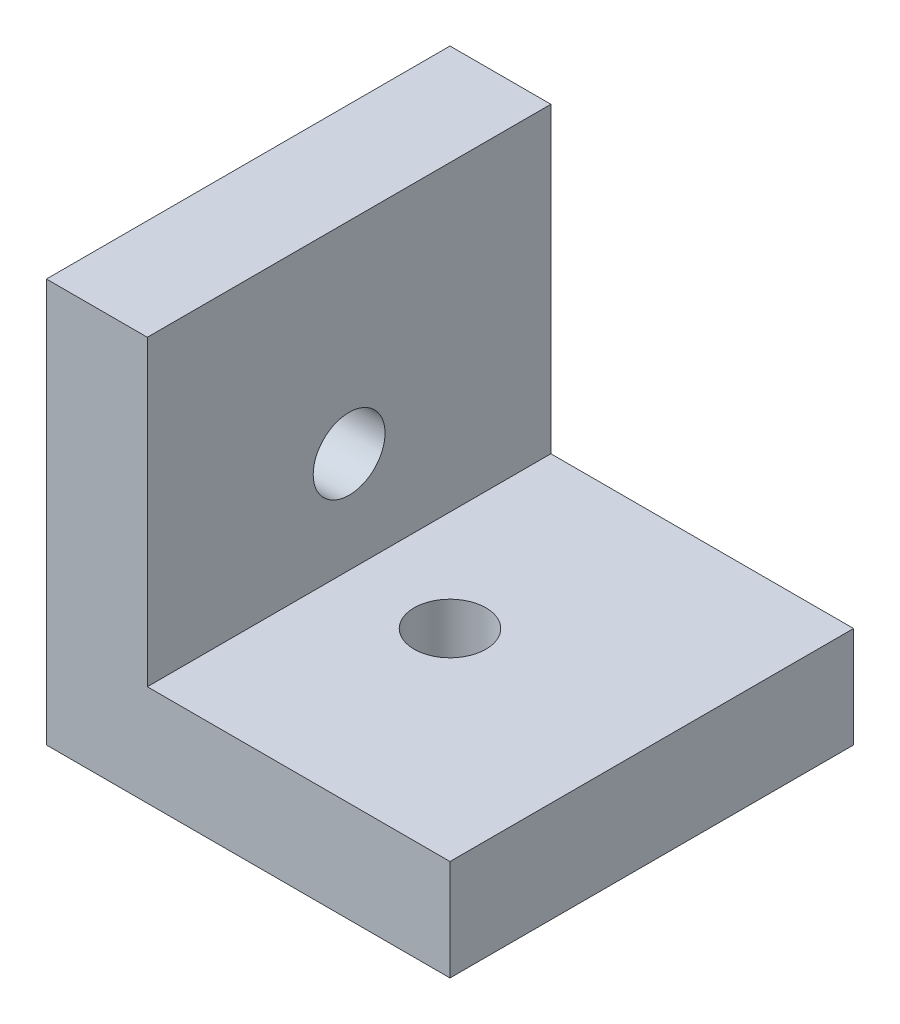
ISO-10303-21;
HEADER;
FILE_DESCRIPTION(('STEP AP214'),'2;1');
FILE_NAME('part.step','',(''),(''),'','','');
FILE_SCHEMA(('AUTOMOTIVE_DESIGN { 1 0 10303 214 1 1 1 1 }'));
ENDSEC;
DATA;
#1=APPLICATION_CONTEXT('core data for automotive mechanical design processes');
#2=APPLICATION_PROTOCOL_DEFINITION('international standard','automotive_design',2000,#1);
#3=PRODUCT_CONTEXT('',#1,'mechanical');
#4=PRODUCT('Part','Part','',(#3));
#5=PRODUCT_RELATED_PRODUCT_CATEGORY('part','',(#4));
#6=PRODUCT_DEFINITION_FORMATION('','',#4);
#7=PRODUCT_DEFINITION_CONTEXT('part definition',#1,'design');
#8=PRODUCT_DEFINITION('design','',#6,#7);
#9=PRODUCT_DEFINITION_SHAPE('','',#8);
#10=(LENGTH_UNIT() NAMED_UNIT(*) SI_UNIT(.MILLI.,.METRE.));
#11=(NAMED_UNIT(*) PLANE_ANGLE_UNIT() SI_UNIT($,.RADIAN.));
#12=(NAMED_UNIT(*) SI_UNIT($,.STERADIAN.) SOLID_ANGLE_UNIT());
#13=UNCERTAINTY_MEASURE_WITH_UNIT(LENGTH_MEASURE(1.E-05),#10,'distance_accuracy_value','');
#14=(GEOMETRIC_REPRESENTATION_CONTEXT(3) GLOBAL_UNCERTAINTY_ASSIGNED_CONTEXT((#13)) GLOBAL_UNIT_ASSIGNED_CONTEXT((#10,
#11,#12)) REPRESENTATION_CONTEXT('',''));
#15=CARTESIAN_POINT('',(0.,0.,0.));
#16=DIRECTION('',(0.,0.,1.));
#17=DIRECTION('',(1.,0.,0.));
#18=AXIS2_PLACEMENT_3D('',#15,#16,#17);
#19=CARTESIAN_POINT('',(-0.520215582321744,11.7280877938981,12.7));
#20=DIRECTION('',(1.,0.,0.));
#21=DIRECTION('',(0.,0.,-1.));
#22=AXIS2_PLACEMENT_3D('',#19,#20,#21);
#23=PLANE('',#22);
#24=CARTESIAN_POINT('',(-0.520215582321744,5.37808779389811,6.35));
#25=DIRECTION('',(-1.,0.,0.));
#26=DIRECTION('',(0.,0.,1.));
#27=AXIS2_PLACEMENT_3D('',#24,#25,#26);
#28=CIRCLE('',#27,1.1303);
#29=CARTESIAN_POINT('',(-0.520215582321744,5.37808779389811,7.4803));
#30=VERTEX_POINT('',#29);
#31=EDGE_CURVE('E165',#30,#30,#28,.T.);
#32=ORIENTED_EDGE('',*,*,#31,.F.);
#33=EDGE_LOOP('',(#32));
#34=FACE_BOUND('',#33,.T.);
#35=DIRECTION('',(0.,-1.,0.));
#36=VECTOR('',#35,1.);
#37=CARTESIAN_POINT('',(-0.520215582321744,11.7280877938981,0.));
#38=LINE('',#37,#36);
#39=CARTESIAN_POINT('',(-0.520215582321744,11.7280877938981,0.));
#40=VERTEX_POINT('',#39);
#41=CARTESIAN_POINT('',(-0.520215582321744,-0.971912206101887,0.));
#42=VERTEX_POINT('',#41);
#43=EDGE_CURVE('E120',#40,#42,#38,.T.);
#44=ORIENTED_EDGE('',*,*,#43,.T.);
#45=DIRECTION('',(0.,0.,-1.));
#46=VECTOR('',#45,1.);
#47=CARTESIAN_POINT('',(-0.520215582321744,-0.971912206101887,12.7));
#48=LINE('',#47,#46);
#49=CARTESIAN_POINT('',(-0.520215582321744,-0.971912206101887,12.7));
#50=VERTEX_POINT('',#49);
#51=EDGE_CURVE('E11',#50,#42,#48,.T.);
#52=ORIENTED_EDGE('',*,*,#51,.F.);
#53=DIRECTION('',(0.,-1.,0.));
#54=VECTOR('',#53,1.);
#55=CARTESIAN_POINT('',(-0.520215582321744,11.7280877938981,12.7));
#56=LINE('',#55,#54);
#57=CARTESIAN_POINT('',(-0.520215582321744,11.7280877938981,12.7));
#58=VERTEX_POINT('',#57);
#59=EDGE_CURVE('E131',#58,#50,#56,.T.);
#60=ORIENTED_EDGE('',*,*,#59,.F.);
#61=DIRECTION('',(0.,0.,-1.));
#62=VECTOR('',#61,1.);
#63=CARTESIAN_POINT('',(-0.520215582321744,11.7280877938981,12.7));
#64=LINE('',#63,#62);
#65=EDGE_CURVE('E116',#58,#40,#64,.T.);
#66=ORIENTED_EDGE('',*,*,#65,.T.);
#67=EDGE_LOOP('',(#44,#52,#60,#66));
#68=FACE_BOUND('',#67,.T.);
#69=ADVANCED_FACE('F35',(#34,#68),#23,.F.);
#70=CARTESIAN_POINT('',(-0.520215582321744,-0.971912206101887,12.7));
#71=DIRECTION('',(0.,1.,0.));
#72=DIRECTION('',(0.,0.,1.));
#73=AXIS2_PLACEMENT_3D('',#70,#71,#72);
#74=PLANE('',#73);
#75=CARTESIAN_POINT('',(5.82978441767826,-0.971912206101887,6.35));
#76=DIRECTION('',(0.,-1.,0.));
#77=DIRECTION('',(0.,0.,-1.));
#78=AXIS2_PLACEMENT_3D('',#75,#76,#77);
#79=CIRCLE('',#78,1.1303);
#80=CARTESIAN_POINT('',(5.82978441767826,-0.971912206101887,5.2197));
#81=VERTEX_POINT('',#80);
#82=EDGE_CURVE('E169',#81,#81,#79,.T.);
#83=ORIENTED_EDGE('',*,*,#82,.F.);
#84=EDGE_LOOP('',(#83));
#85=FACE_BOUND('',#84,.T.);
#86=DIRECTION('',(1.,0.,0.));
#87=VECTOR('',#86,1.);
#88=CARTESIAN_POINT('',(-0.520215582321744,-0.971912206101887,0.));
#89=LINE('',#88,#87);
#90=CARTESIAN_POINT('',(12.1797844176783,-0.971912206101887,0.));
#91=VERTEX_POINT('',#90);
#92=EDGE_CURVE('E123',#42,#91,#89,.T.);
#93=ORIENTED_EDGE('',*,*,#92,.T.);
#94=DIRECTION('',(0.,0.,-1.));
#95=VECTOR('',#94,1.);
#96=CARTESIAN_POINT('',(12.1797844176783,-0.971912206101887,12.7));
#97=LINE('',#96,#95);
#98=CARTESIAN_POINT('',(12.1797844176783,-0.971912206101887,12.7));
#99=VERTEX_POINT('',#98);
#100=EDGE_CURVE('E44',#99,#91,#97,.T.);
#101=ORIENTED_EDGE('',*,*,#100,.F.);
#102=DIRECTION('',(1.,0.,0.));
#103=VECTOR('',#102,1.);
#104=CARTESIAN_POINT('',(-0.520215582321744,-0.971912206101887,12.7));
#105=LINE('',#104,#103);
#106=EDGE_CURVE('E89',#50,#99,#105,.T.);
#107=ORIENTED_EDGE('',*,*,#106,.F.);
#108=ORIENTED_EDGE('',*,*,#51,.T.);
#109=EDGE_LOOP('',(#93,#101,#107,#108));
#110=FACE_BOUND('',#109,.T.);
#111=ADVANCED_FACE('F157',(#85,#110),#74,.F.);
#112=CARTESIAN_POINT('',(12.1797844176783,2.20308779389811,12.7));
#113=DIRECTION('',(-1.,0.,0.));
#114=DIRECTION('',(0.,-1.,0.));
#115=AXIS2_PLACEMENT_3D('',#112,#113,#114);
#116=PLANE('',#115);
#117=DIRECTION('',(0.,1.,0.));
#118=VECTOR('',#117,1.);
#119=CARTESIAN_POINT('',(12.1797844176783,2.20308779389811,0.));
#120=LINE('',#119,#118);
#121=CARTESIAN_POINT('',(12.1797844176783,2.20308779389811,0.));
#122=VERTEX_POINT('',#121);
#123=EDGE_CURVE('E126',#91,#122,#120,.T.);
#124=ORIENTED_EDGE('',*,*,#123,.T.);
#125=DIRECTION('',(0.,0.,-1.));
#126=VECTOR('',#125,1.);
#127=CARTESIAN_POINT('',(12.1797844176783,2.20308779389811,12.7));
#128=LINE('',#127,#126);
#129=CARTESIAN_POINT('',(12.1797844176783,2.20308779389811,12.7));
#130=VERTEX_POINT('',#129);
#131=EDGE_CURVE('E111',#130,#122,#128,.T.);
#132=ORIENTED_EDGE('',*,*,#131,.F.);
#133=DIRECTION('',(0.,1.,0.));
#134=VECTOR('',#133,1.);
#135=CARTESIAN_POINT('',(12.1797844176783,2.20308779389811,12.7));
#136=LINE('',#135,#134);
#137=EDGE_CURVE('E102',#99,#130,#136,.T.);
#138=ORIENTED_EDGE('',*,*,#137,.F.);
#139=ORIENTED_EDGE('',*,*,#100,.T.);
#140=EDGE_LOOP('',(#124,#132,#138,#139));
#141=FACE_BOUND('',#140,.T.);
#142=ADVANCED_FACE('F138',(#141),#116,.F.);
#143=CARTESIAN_POINT('',(12.1797844176783,2.20308779389811,12.7));
#144=DIRECTION('',(0.,-1.,0.));
#145=DIRECTION('',(1.,0.,0.));
#146=AXIS2_PLACEMENT_3D('',#143,#144,#145);
#147=PLANE('',#146);
#148=CARTESIAN_POINT('',(5.82978441767826,2.20308779389811,6.35));
#149=DIRECTION('',(0.,-1.,0.));
#150=DIRECTION('',(1.,0.,0.));
#151=AXIS2_PLACEMENT_3D('',#148,#149,#150);
#152=CIRCLE('',#151,1.1303);
#153=CARTESIAN_POINT('',(6.96008441767825,2.20308779389811,6.35));
#154=VERTEX_POINT('',#153);
#155=EDGE_CURVE('E124',#154,#154,#152,.T.);
#156=ORIENTED_EDGE('',*,*,#155,.T.);
#157=EDGE_LOOP('',(#156));
#158=FACE_BOUND('',#157,.T.);
#159=DIRECTION('',(-1.,0.,0.));
#160=VECTOR('',#159,1.);
#161=CARTESIAN_POINT('',(12.1797844176783,2.20308779389811,0.));
#162=LINE('',#161,#160);
#163=CARTESIAN_POINT('',(2.65478441767826,2.20308779389811,0.));
#164=VERTEX_POINT('',#163);
#165=EDGE_CURVE('E110',#122,#164,#162,.T.);
#166=ORIENTED_EDGE('',*,*,#165,.T.);
#167=DIRECTION('',(0.,0.,-1.));
#168=VECTOR('',#167,1.);
#169=CARTESIAN_POINT('',(2.65478441767826,2.20308779389811,12.7));
#170=LINE('',#169,#168);
#171=CARTESIAN_POINT('',(2.65478441767826,2.20308779389811,12.7));
#172=VERTEX_POINT('',#171);
#173=EDGE_CURVE('E107',#172,#164,#170,.T.);
#174=ORIENTED_EDGE('',*,*,#173,.F.);
#175=DIRECTION('',(-1.,0.,0.));
#176=VECTOR('',#175,1.);
#177=CARTESIAN_POINT('',(12.1797844176783,2.20308779389811,12.7));
#178=LINE('',#177,#176);
#179=EDGE_CURVE('E96',#130,#172,#178,.T.);
#180=ORIENTED_EDGE('',*,*,#179,.F.);
#181=ORIENTED_EDGE('',*,*,#131,.T.);
#182=EDGE_LOOP('',(#166,#174,#180,#181));
#183=FACE_BOUND('',#182,.T.);
#184=ADVANCED_FACE('F108',(#158,#183),#147,.F.);
#185=CARTESIAN_POINT('',(2.65478441767825,11.7280877938981,12.7));
#186=DIRECTION('',(-1.,0.,0.));
#187=DIRECTION('',(0.,-1.,0.));
#188=AXIS2_PLACEMENT_3D('',#185,#186,#187);
#189=PLANE('',#188);
#190=CARTESIAN_POINT('',(2.65478441767826,5.37808779389811,6.35));
#191=DIRECTION('',(-1.,0.,0.));
#192=DIRECTION('',(0.,-1.,0.));
#193=AXIS2_PLACEMENT_3D('',#190,#191,#192);
#194=CIRCLE('',#193,1.1303);
#195=CARTESIAN_POINT('',(2.65478441767826,4.24778779389811,6.35));
#196=VERTEX_POINT('',#195);
#197=EDGE_CURVE('E38',#196,#196,#194,.T.);
#198=ORIENTED_EDGE('',*,*,#197,.T.);
#199=EDGE_LOOP('',(#198));
#200=FACE_BOUND('',#199,.T.);
#201=DIRECTION('',(0.,1.,0.));
#202=VECTOR('',#201,1.);
#203=CARTESIAN_POINT('',(2.65478441767825,11.7280877938981,0.));
#204=LINE('',#203,#202);
#205=CARTESIAN_POINT('',(2.65478441767825,11.7280877938981,0.));
#206=VERTEX_POINT('',#205);
#207=EDGE_CURVE('E75',#164,#206,#204,.T.);
#208=ORIENTED_EDGE('',*,*,#207,.T.);
#209=DIRECTION('',(0.,0.,-1.));
#210=VECTOR('',#209,1.);
#211=CARTESIAN_POINT('',(2.65478441767825,11.7280877938981,12.7));
#212=LINE('',#211,#210);
#213=CARTESIAN_POINT('',(2.65478441767825,11.7280877938981,12.7));
#214=VERTEX_POINT('',#213);
#215=EDGE_CURVE('E112',#214,#206,#212,.T.);
#216=ORIENTED_EDGE('',*,*,#215,.F.);
#217=DIRECTION('',(0.,1.,0.));
#218=VECTOR('',#217,1.);
#219=CARTESIAN_POINT('',(2.65478441767825,11.7280877938981,12.7));
#220=LINE('',#219,#218);
#221=EDGE_CURVE('E100',#172,#214,#220,.T.);
#222=ORIENTED_EDGE('',*,*,#221,.F.);
#223=ORIENTED_EDGE('',*,*,#173,.T.);
#224=EDGE_LOOP('',(#208,#216,#222,#223));
#225=FACE_BOUND('',#224,.T.);
#226=ADVANCED_FACE('F114',(#200,#225),#189,.F.);
#227=CARTESIAN_POINT('',(-0.520215582321744,11.7280877938981,12.7));
#228=DIRECTION('',(0.,-1.,0.));
#229=DIRECTION('',(0.,0.,-1.));
#230=AXIS2_PLACEMENT_3D('',#227,#228,#229);
#231=PLANE('',#230);
#232=DIRECTION('',(-1.,0.,0.));
#233=VECTOR('',#232,1.);
#234=CARTESIAN_POINT('',(-0.520215582321744,11.7280877938981,0.));
#235=LINE('',#234,#233);
#236=EDGE_CURVE('E81',#206,#40,#235,.T.);
#237=ORIENTED_EDGE('',*,*,#236,.T.);
#238=ORIENTED_EDGE('',*,*,#65,.F.);
#239=DIRECTION('',(-1.,0.,0.));
#240=VECTOR('',#239,1.);
#241=CARTESIAN_POINT('',(-0.520215582321744,11.7280877938981,12.7));
#242=LINE('',#241,#240);
#243=EDGE_CURVE('E52',#214,#58,#242,.T.);
#244=ORIENTED_EDGE('',*,*,#243,.F.);
#245=ORIENTED_EDGE('',*,*,#215,.T.);
#246=EDGE_LOOP('',(#237,#238,#244,#245));
#247=FACE_BOUND('',#246,.T.);
#248=ADVANCED_FACE('F145',(#247),#231,.F.);
#249=CARTESIAN_POINT('',(0.,0.,12.7));
#250=DIRECTION('',(0.,0.,1.));
#251=DIRECTION('',(1.,0.,0.));
#252=AXIS2_PLACEMENT_3D('',#249,#250,#251);
#253=PLANE('',#252);
#254=ORIENTED_EDGE('',*,*,#59,.T.);
#255=ORIENTED_EDGE('',*,*,#106,.T.);
#256=ORIENTED_EDGE('',*,*,#137,.T.);
#257=ORIENTED_EDGE('',*,*,#179,.T.);
#258=ORIENTED_EDGE('',*,*,#221,.T.);
#259=ORIENTED_EDGE('',*,*,#243,.T.);
#260=EDGE_LOOP('',(#254,#255,#256,#257,#258,#259));
#261=FACE_BOUND('',#260,.T.);
#262=ADVANCED_FACE('F98',(#261),#253,.T.);
#263=CARTESIAN_POINT('',(0.,0.,0.));
#264=DIRECTION('',(0.,0.,1.));
#265=DIRECTION('',(1.,0.,0.));
#266=AXIS2_PLACEMENT_3D('',#263,#264,#265);
#267=PLANE('',#266);
#268=ORIENTED_EDGE('',*,*,#43,.F.);
#269=ORIENTED_EDGE('',*,*,#236,.F.);
#270=ORIENTED_EDGE('',*,*,#207,.F.);
#271=ORIENTED_EDGE('',*,*,#165,.F.);
#272=ORIENTED_EDGE('',*,*,#123,.F.);
#273=ORIENTED_EDGE('',*,*,#92,.F.);
#274=EDGE_LOOP('',(#268,#269,#270,#271,#272,#273));
#275=FACE_BOUND('',#274,.T.);
#276=ADVANCED_FACE('F141',(#275),#267,.F.);
#277=CARTESIAN_POINT('',(5.82978441767826,-0.971912206101887,6.35));
#278=DIRECTION('',(0.,-1.,0.));
#279=DIRECTION('',(0.,0.,-1.));
#280=AXIS2_PLACEMENT_3D('',#277,#278,#279);
#281=CYLINDRICAL_SURFACE('',#280,1.1303);
#282=ORIENTED_EDGE('',*,*,#82,.T.);
#283=EDGE_LOOP('',(#282));
#284=FACE_BOUND('',#283,.T.);
#285=ORIENTED_EDGE('',*,*,#155,.F.);
#286=EDGE_LOOP('',(#285));
#287=FACE_BOUND('',#286,.T.);
#288=ADVANCED_FACE('F179',(#284,#287),#281,.F.);
#289=CARTESIAN_POINT('',(-0.520215582321744,5.37808779389811,6.35));
#290=DIRECTION('',(-1.,0.,0.));
#291=DIRECTION('',(0.,0.,1.));
#292=AXIS2_PLACEMENT_3D('',#289,#290,#291);
#293=CYLINDRICAL_SURFACE('',#292,1.1303);
#294=ORIENTED_EDGE('',*,*,#31,.T.);
#295=EDGE_LOOP('',(#294));
#296=FACE_BOUND('',#295,.T.);
#297=ORIENTED_EDGE('',*,*,#197,.F.);
#298=EDGE_LOOP('',(#297));
#299=FACE_BOUND('',#298,.T.);
#300=ADVANCED_FACE('F181',(#296,#299),#293,.F.);
#301=CLOSED_SHELL('',(#69,#111,#142,#184,#226,#248,#262,#276,#288,#300));
#302=MANIFOLD_SOLID_BREP('B2',#301);
#303=ADVANCED_BREP_SHAPE_REPRESENTATION('',(#18,#302),#14);
#304=SHAPE_DEFINITION_REPRESENTATION(#9,#303);
ENDSEC;
END-ISO-10303-21;
